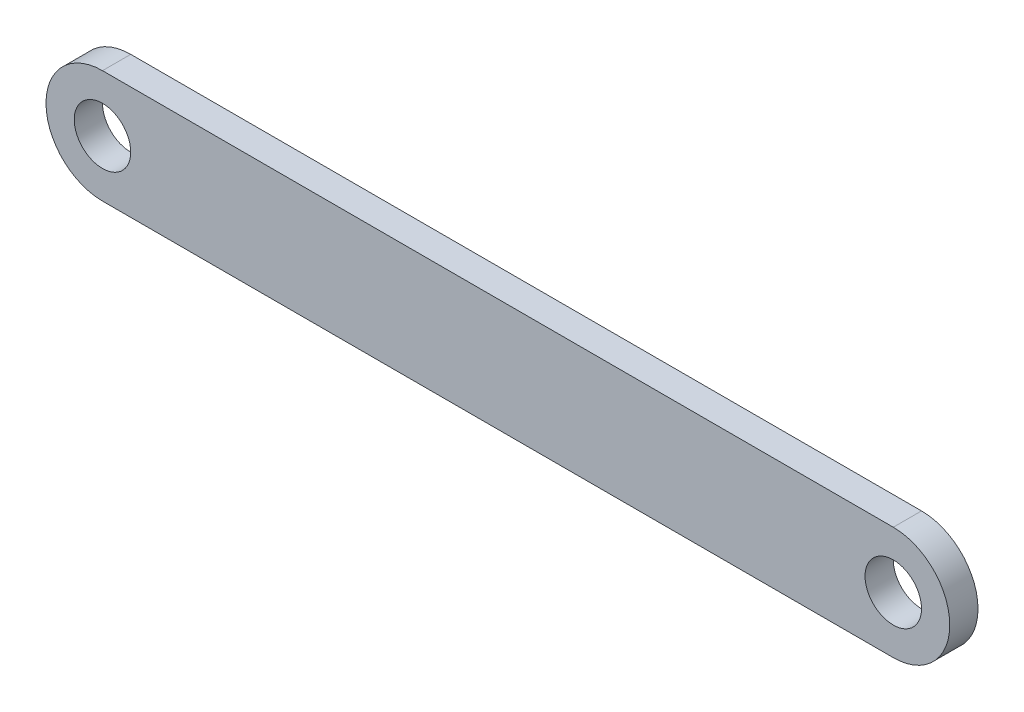
ISO-10303-21;
HEADER;
FILE_DESCRIPTION(('STEP AP214'),'2;1');
FILE_NAME('part.step','',(''),(''),'','','');
FILE_SCHEMA(('AUTOMOTIVE_DESIGN { 1 0 10303 214 1 1 1 1 }'));
ENDSEC;
DATA;
#1=APPLICATION_CONTEXT('core data for automotive mechanical design processes');
#2=APPLICATION_PROTOCOL_DEFINITION('international standard','automotive_design',2000,#1);
#3=PRODUCT_CONTEXT('',#1,'mechanical');
#4=PRODUCT('Part','Part','',(#3));
#5=PRODUCT_RELATED_PRODUCT_CATEGORY('part','',(#4));
#6=PRODUCT_DEFINITION_FORMATION('','',#4);
#7=PRODUCT_DEFINITION_CONTEXT('part definition',#1,'design');
#8=PRODUCT_DEFINITION('design','',#6,#7);
#9=PRODUCT_DEFINITION_SHAPE('','',#8);
#10=(LENGTH_UNIT() NAMED_UNIT(*) SI_UNIT(.MILLI.,.METRE.));
#11=(NAMED_UNIT(*) PLANE_ANGLE_UNIT() SI_UNIT($,.RADIAN.));
#12=(NAMED_UNIT(*) SI_UNIT($,.STERADIAN.) SOLID_ANGLE_UNIT());
#13=UNCERTAINTY_MEASURE_WITH_UNIT(LENGTH_MEASURE(1.E-05),#10,'distance_accuracy_value','');
#14=(GEOMETRIC_REPRESENTATION_CONTEXT(3) GLOBAL_UNCERTAINTY_ASSIGNED_CONTEXT((#13)) GLOBAL_UNIT_ASSIGNED_CONTEXT((#10,
#11,#12)) REPRESENTATION_CONTEXT('',''));
#15=CARTESIAN_POINT('',(0.,0.,0.));
#16=DIRECTION('',(0.,0.,1.));
#17=DIRECTION('',(1.,0.,0.));
#18=AXIS2_PLACEMENT_3D('',#15,#16,#17);
#19=CARTESIAN_POINT('',(-70.,0.,5.));
#20=DIRECTION('',(0.,0.,1.));
#21=DIRECTION('',(1.,0.,0.));
#22=AXIS2_PLACEMENT_3D('',#19,#20,#21);
#23=PLANE('',#22);
#24=CARTESIAN_POINT('',(70.,0.,5.));
#25=DIRECTION('',(0.,0.,1.));
#26=DIRECTION('',(1.,0.,0.));
#27=AXIS2_PLACEMENT_3D('',#24,#25,#26);
#28=CIRCLE('',#27,5.);
#29=CARTESIAN_POINT('',(75.,0.,5.));
#30=VERTEX_POINT('',#29);
#31=EDGE_CURVE('E119',#30,#30,#28,.T.);
#32=ORIENTED_EDGE('',*,*,#31,.F.);
#33=EDGE_LOOP('',(#32));
#34=FACE_BOUND('',#33,.T.);
#35=CARTESIAN_POINT('',(-70.,0.,5.));
#36=DIRECTION('',(0.,0.,1.));
#37=DIRECTION('',(1.,0.,0.));
#38=AXIS2_PLACEMENT_3D('',#35,#36,#37);
#39=CIRCLE('',#38,10.);
#40=CARTESIAN_POINT('',(-70.,10.,5.));
#41=VERTEX_POINT('',#40);
#42=CARTESIAN_POINT('',(-70.,-10.,5.));
#43=VERTEX_POINT('',#42);
#44=EDGE_CURVE('E97',#41,#43,#39,.T.);
#45=ORIENTED_EDGE('',*,*,#44,.T.);
#46=DIRECTION('',(1.,0.,0.));
#47=VECTOR('',#46,1.);
#48=CARTESIAN_POINT('',(-70.,-10.,5.));
#49=LINE('',#48,#47);
#50=CARTESIAN_POINT('',(70.,-10.,5.));
#51=VERTEX_POINT('',#50);
#52=EDGE_CURVE('E93',#43,#51,#49,.T.);
#53=ORIENTED_EDGE('',*,*,#52,.T.);
#54=CARTESIAN_POINT('',(70.,0.,5.));
#55=DIRECTION('',(0.,0.,1.));
#56=DIRECTION('',(1.,0.,0.));
#57=AXIS2_PLACEMENT_3D('',#54,#55,#56);
#58=CIRCLE('',#57,10.);
#59=CARTESIAN_POINT('',(70.,10.,5.));
#60=VERTEX_POINT('',#59);
#61=EDGE_CURVE('E96',#51,#60,#58,.T.);
#62=ORIENTED_EDGE('',*,*,#61,.T.);
#63=DIRECTION('',(-1.,0.,0.));
#64=VECTOR('',#63,1.);
#65=CARTESIAN_POINT('',(-70.,10.,5.));
#66=LINE('',#65,#64);
#67=EDGE_CURVE('E64',#60,#41,#66,.T.);
#68=ORIENTED_EDGE('',*,*,#67,.T.);
#69=EDGE_LOOP('',(#45,#53,#62,#68));
#70=FACE_BOUND('',#69,.T.);
#71=CARTESIAN_POINT('',(-70.,0.,5.));
#72=DIRECTION('',(0.,0.,1.));
#73=DIRECTION('',(1.,0.,0.));
#74=AXIS2_PLACEMENT_3D('',#71,#72,#73);
#75=CIRCLE('',#74,5.);
#76=CARTESIAN_POINT('',(-65.,0.,5.));
#77=VERTEX_POINT('',#76);
#78=EDGE_CURVE('E139',#77,#77,#75,.T.);
#79=ORIENTED_EDGE('',*,*,#78,.F.);
#80=EDGE_LOOP('',(#79));
#81=FACE_BOUND('',#80,.T.);
#82=ADVANCED_FACE('F44',(#34,#70,#81),#23,.T.);
#83=CARTESIAN_POINT('',(-70.,0.,0.));
#84=DIRECTION('',(0.,0.,1.));
#85=DIRECTION('',(1.,0.,0.));
#86=AXIS2_PLACEMENT_3D('',#83,#84,#85);
#87=PLANE('',#86);
#88=CARTESIAN_POINT('',(-70.,0.,0.));
#89=DIRECTION('',(0.,0.,1.));
#90=DIRECTION('',(1.,0.,0.));
#91=AXIS2_PLACEMENT_3D('',#88,#89,#90);
#92=CIRCLE('',#91,10.);
#93=CARTESIAN_POINT('',(-70.,10.,0.));
#94=VERTEX_POINT('',#93);
#95=CARTESIAN_POINT('',(-70.,-10.,0.));
#96=VERTEX_POINT('',#95);
#97=EDGE_CURVE('E114',#94,#96,#92,.T.);
#98=ORIENTED_EDGE('',*,*,#97,.F.);
#99=DIRECTION('',(-1.,0.,0.));
#100=VECTOR('',#99,1.);
#101=CARTESIAN_POINT('',(-70.,10.,0.));
#102=LINE('',#101,#100);
#103=CARTESIAN_POINT('',(70.,10.,0.));
#104=VERTEX_POINT('',#103);
#105=EDGE_CURVE('E86',#104,#94,#102,.T.);
#106=ORIENTED_EDGE('',*,*,#105,.F.);
#107=CARTESIAN_POINT('',(70.,0.,0.));
#108=DIRECTION('',(0.,0.,1.));
#109=DIRECTION('',(1.,0.,0.));
#110=AXIS2_PLACEMENT_3D('',#107,#108,#109);
#111=CIRCLE('',#110,10.);
#112=CARTESIAN_POINT('',(70.,-10.,0.));
#113=VERTEX_POINT('',#112);
#114=EDGE_CURVE('E79',#113,#104,#111,.T.);
#115=ORIENTED_EDGE('',*,*,#114,.F.);
#116=DIRECTION('',(1.,0.,0.));
#117=VECTOR('',#116,1.);
#118=CARTESIAN_POINT('',(-70.,-10.,0.));
#119=LINE('',#118,#117);
#120=EDGE_CURVE('E104',#96,#113,#119,.T.);
#121=ORIENTED_EDGE('',*,*,#120,.F.);
#122=EDGE_LOOP('',(#98,#106,#115,#121));
#123=FACE_BOUND('',#122,.T.);
#124=CARTESIAN_POINT('',(70.,0.,0.));
#125=DIRECTION('',(0.,0.,1.));
#126=DIRECTION('',(1.,0.,0.));
#127=AXIS2_PLACEMENT_3D('',#124,#125,#126);
#128=CIRCLE('',#127,5.);
#129=CARTESIAN_POINT('',(75.,0.,0.));
#130=VERTEX_POINT('',#129);
#131=EDGE_CURVE('E136',#130,#130,#128,.T.);
#132=ORIENTED_EDGE('',*,*,#131,.T.);
#133=EDGE_LOOP('',(#132));
#134=FACE_BOUND('',#133,.T.);
#135=CARTESIAN_POINT('',(-70.,0.,0.));
#136=DIRECTION('',(0.,0.,1.));
#137=DIRECTION('',(1.,0.,0.));
#138=AXIS2_PLACEMENT_3D('',#135,#136,#137);
#139=CIRCLE('',#138,5.);
#140=CARTESIAN_POINT('',(-65.,0.,0.));
#141=VERTEX_POINT('',#140);
#142=EDGE_CURVE('E143',#141,#141,#139,.T.);
#143=ORIENTED_EDGE('',*,*,#142,.T.);
#144=EDGE_LOOP('',(#143));
#145=FACE_BOUND('',#144,.T.);
#146=ADVANCED_FACE('F131',(#123,#134,#145),#87,.F.);
#147=CARTESIAN_POINT('',(-70.,0.,5.));
#148=DIRECTION('',(0.,0.,-1.));
#149=DIRECTION('',(-1.,0.,0.));
#150=AXIS2_PLACEMENT_3D('',#147,#148,#149);
#151=CYLINDRICAL_SURFACE('',#150,10.);
#152=ORIENTED_EDGE('',*,*,#97,.T.);
#153=DIRECTION('',(0.,0.,-1.));
#154=VECTOR('',#153,1.);
#155=CARTESIAN_POINT('',(-70.,-10.,5.));
#156=LINE('',#155,#154);
#157=EDGE_CURVE('E11',#43,#96,#156,.T.);
#158=ORIENTED_EDGE('',*,*,#157,.F.);
#159=ORIENTED_EDGE('',*,*,#44,.F.);
#160=DIRECTION('',(0.,0.,-1.));
#161=VECTOR('',#160,1.);
#162=CARTESIAN_POINT('',(-70.,10.,5.));
#163=LINE('',#162,#161);
#164=EDGE_CURVE('E110',#41,#94,#163,.T.);
#165=ORIENTED_EDGE('',*,*,#164,.T.);
#166=EDGE_LOOP('',(#152,#158,#159,#165));
#167=FACE_BOUND('',#166,.T.);
#168=ADVANCED_FACE('F50',(#167),#151,.T.);
#169=CARTESIAN_POINT('',(-70.,-10.,5.));
#170=DIRECTION('',(0.,1.,0.));
#171=DIRECTION('',(-1.,0.,0.));
#172=AXIS2_PLACEMENT_3D('',#169,#170,#171);
#173=PLANE('',#172);
#174=ORIENTED_EDGE('',*,*,#120,.T.);
#175=DIRECTION('',(0.,0.,-1.));
#176=VECTOR('',#175,1.);
#177=CARTESIAN_POINT('',(70.,-10.,5.));
#178=LINE('',#177,#176);
#179=EDGE_CURVE('E54',#51,#113,#178,.T.);
#180=ORIENTED_EDGE('',*,*,#179,.F.);
#181=ORIENTED_EDGE('',*,*,#52,.F.);
#182=ORIENTED_EDGE('',*,*,#157,.T.);
#183=EDGE_LOOP('',(#174,#180,#181,#182));
#184=FACE_BOUND('',#183,.T.);
#185=ADVANCED_FACE('F105',(#184),#173,.F.);
#186=CARTESIAN_POINT('',(70.,0.,5.));
#187=DIRECTION('',(0.,0.,-1.));
#188=DIRECTION('',(-1.,0.,0.));
#189=AXIS2_PLACEMENT_3D('',#186,#187,#188);
#190=CYLINDRICAL_SURFACE('',#189,10.);
#191=ORIENTED_EDGE('',*,*,#114,.T.);
#192=DIRECTION('',(0.,0.,-1.));
#193=VECTOR('',#192,1.);
#194=CARTESIAN_POINT('',(70.,10.,5.));
#195=LINE('',#194,#193);
#196=EDGE_CURVE('E103',#60,#104,#195,.T.);
#197=ORIENTED_EDGE('',*,*,#196,.F.);
#198=ORIENTED_EDGE('',*,*,#61,.F.);
#199=ORIENTED_EDGE('',*,*,#179,.T.);
#200=EDGE_LOOP('',(#191,#197,#198,#199));
#201=FACE_BOUND('',#200,.T.);
#202=ADVANCED_FACE('F106',(#201),#190,.T.);
#203=CARTESIAN_POINT('',(-70.,10.,5.));
#204=DIRECTION('',(0.,-1.,0.));
#205=DIRECTION('',(1.,0.,0.));
#206=AXIS2_PLACEMENT_3D('',#203,#204,#205);
#207=PLANE('',#206);
#208=ORIENTED_EDGE('',*,*,#105,.T.);
#209=ORIENTED_EDGE('',*,*,#164,.F.);
#210=ORIENTED_EDGE('',*,*,#67,.F.);
#211=ORIENTED_EDGE('',*,*,#196,.T.);
#212=EDGE_LOOP('',(#208,#209,#210,#211));
#213=FACE_BOUND('',#212,.T.);
#214=ADVANCED_FACE('F126',(#213),#207,.F.);
#215=CARTESIAN_POINT('',(70.,0.,5.));
#216=DIRECTION('',(0.,0.,-1.));
#217=DIRECTION('',(-1.,0.,0.));
#218=AXIS2_PLACEMENT_3D('',#215,#216,#217);
#219=CYLINDRICAL_SURFACE('',#218,5.);
#220=ORIENTED_EDGE('',*,*,#31,.T.);
#221=EDGE_LOOP('',(#220));
#222=FACE_BOUND('',#221,.T.);
#223=ORIENTED_EDGE('',*,*,#131,.F.);
#224=EDGE_LOOP('',(#223));
#225=FACE_BOUND('',#224,.T.);
#226=ADVANCED_FACE('F164',(#222,#225),#219,.F.);
#227=CARTESIAN_POINT('',(-70.,0.,5.));
#228=DIRECTION('',(0.,0.,-1.));
#229=DIRECTION('',(-1.,0.,0.));
#230=AXIS2_PLACEMENT_3D('',#227,#228,#229);
#231=CYLINDRICAL_SURFACE('',#230,5.);
#232=ORIENTED_EDGE('',*,*,#78,.T.);
#233=EDGE_LOOP('',(#232));
#234=FACE_BOUND('',#233,.T.);
#235=ORIENTED_EDGE('',*,*,#142,.F.);
#236=EDGE_LOOP('',(#235));
#237=FACE_BOUND('',#236,.T.);
#238=ADVANCED_FACE('F152',(#234,#237),#231,.F.);
#239=CLOSED_SHELL('',(#82,#146,#168,#185,#202,#214,#226,#238));
#240=MANIFOLD_SOLID_BREP('B2',#239);
#241=ADVANCED_BREP_SHAPE_REPRESENTATION('',(#18,#240),#14);
#242=SHAPE_DEFINITION_REPRESENTATION(#9,#241);
ENDSEC;
END-ISO-10303-21;
